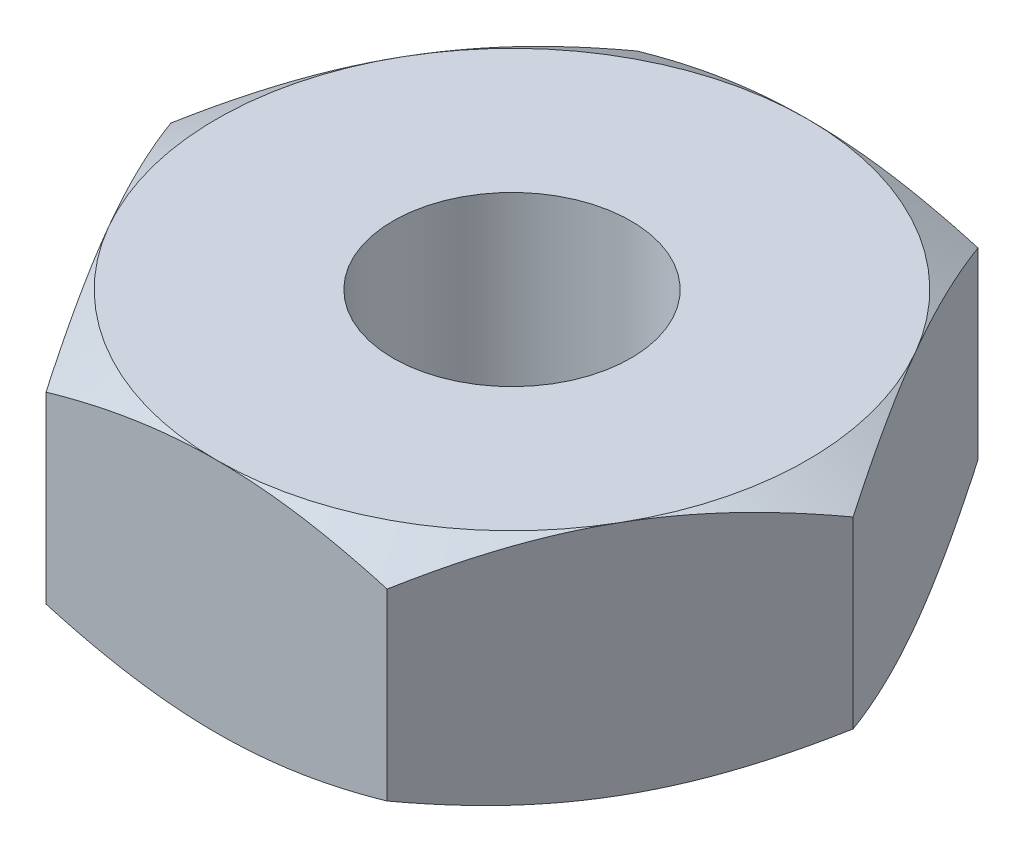
ISO-10303-21;
HEADER;
FILE_DESCRIPTION(('STEP AP214'),'2;1');
FILE_NAME('part.step','',(''),(''),'','','');
FILE_SCHEMA(('AUTOMOTIVE_DESIGN { 1 0 10303 214 1 1 1 1 }'));
ENDSEC;
DATA;
#1=APPLICATION_CONTEXT('core data for automotive mechanical design processes');
#2=APPLICATION_PROTOCOL_DEFINITION('international standard','automotive_design',2000,#1);
#3=PRODUCT_CONTEXT('',#1,'mechanical');
#4=PRODUCT('Part','Part','',(#3));
#5=PRODUCT_RELATED_PRODUCT_CATEGORY('part','',(#4));
#6=PRODUCT_DEFINITION_FORMATION('','',#4);
#7=PRODUCT_DEFINITION_CONTEXT('part definition',#1,'design');
#8=PRODUCT_DEFINITION('design','',#6,#7);
#9=PRODUCT_DEFINITION_SHAPE('','',#8);
#10=(LENGTH_UNIT() NAMED_UNIT(*) SI_UNIT(.MILLI.,.METRE.));
#11=(NAMED_UNIT(*) PLANE_ANGLE_UNIT() SI_UNIT($,.RADIAN.));
#12=(NAMED_UNIT(*) SI_UNIT($,.STERADIAN.) SOLID_ANGLE_UNIT());
#13=UNCERTAINTY_MEASURE_WITH_UNIT(LENGTH_MEASURE(1.E-05),#10,'distance_accuracy_value','');
#14=(GEOMETRIC_REPRESENTATION_CONTEXT(3) GLOBAL_UNCERTAINTY_ASSIGNED_CONTEXT((#13)) GLOBAL_UNIT_ASSIGNED_CONTEXT((#10,
#11,#12)) REPRESENTATION_CONTEXT('',''));
#15=CARTESIAN_POINT('',(0.,0.,0.));
#16=DIRECTION('',(0.,0.,1.));
#17=DIRECTION('',(1.,0.,0.));
#18=AXIS2_PLACEMENT_3D('',#15,#16,#17);
#19=CARTESIAN_POINT('',(0.,-0.223290993692603,0.));
#20=DIRECTION('',(0.,-1.,0.));
#21=DIRECTION('',(0.,0.,-1.));
#22=AXIS2_PLACEMENT_3D('',#19,#20,#21);
#23=CONICAL_SURFACE('',#22,2.88675134594813,1.0471975511966);
#24=CARTESIAN_POINT('',(-3.82804499372432,-1.1963167632754,2.5));
#25=CARTESIAN_POINT('',(-3.71828085649172,-1.14327266922931,2.5));
#26=CARTESIAN_POINT('',(-3.60825720059553,-1.09075587737962,2.5));
#27=CARTESIAN_POINT('',(-3.38755052986221,-0.987078216748227,2.5));
#28=CARTESIAN_POINT('',(-3.27686740487454,-0.935917582729519,2.5));
#29=CARTESIAN_POINT('',(-3.05410357303958,-0.834984039411597,2.5));
#30=CARTESIAN_POINT('',(-2.94201849305851,-0.785220746914398,2.5));
#31=CARTESIAN_POINT('',(-2.71692709217039,-0.687831615887685,2.5));
#32=CARTESIAN_POINT('',(-2.6039208196471,-0.640205665942511,2.5));
#33=CARTESIAN_POINT('',(-2.3754044171561,-0.547094156496475,2.5));
#34=CARTESIAN_POINT('',(-2.25988058014231,-0.501642052634902,2.5));
#35=CARTESIAN_POINT('',(-2.02747029246855,-0.414297644349636,2.5));
#36=CARTESIAN_POINT('',(-1.91058369184875,-0.372405735979064,2.5));
#37=CARTESIAN_POINT('',(-1.67550198908606,-0.2933073427693,2.5));
#38=CARTESIAN_POINT('',(-1.5573102732053,-0.256090896739897,2.5));
#39=CARTESIAN_POINT('',(-1.31924659147406,-0.187552097840316,2.5));
#40=CARTESIAN_POINT('',(-1.19937516991093,-0.156227881047969,2.5));
#41=CARTESIAN_POINT('',(-0.957870204363746,-0.100994246846276,2.5));
#42=CARTESIAN_POINT('',(-0.836236200197806,-0.0770868037228372,2.5));
#43=CARTESIAN_POINT('',(-0.591501703670343,-0.0382963974514643,2.5));
#44=CARTESIAN_POINT('',(-0.468401210012355,-0.0234134422823114,2.5));
#45=CARTESIAN_POINT('',(-0.222157493517461,-0.00398863321839736,2.5));
#46=CARTESIAN_POINT('',(-0.099019569433754,0.000618687975651005,2.5));
#47=CARTESIAN_POINT('',(0.147170053504671,-0.000752541484247362,2.5));
#48=CARTESIAN_POINT('',(0.270221766445131,-0.00672834425959445,2.5));
#49=CARTESIAN_POINT('',(0.480350397015951,-0.0255492091334948,2.5));
#50=CARTESIAN_POINT('',(0.56765913648864,-0.0359433100274445,2.5));
#51=CARTESIAN_POINT('',(0.741602181646861,-0.0613833814666835,2.5));
#52=CARTESIAN_POINT('',(0.828236378756336,-0.0764300856615301,2.5));
#53=CARTESIAN_POINT('',(1.08705653408106,-0.127759419343896,2.5));
#54=CARTESIAN_POINT('',(1.25802931580452,-0.170218054015723,2.5));
#55=CARTESIAN_POINT('',(1.51386408134078,-0.243447724573255,2.5));
#56=CARTESIAN_POINT('',(1.60005960225962,-0.269821213632275,2.5));
#57=CARTESIAN_POINT('',(1.77155099438378,-0.325177862642354,2.5));
#58=CARTESIAN_POINT('',(1.85684744139724,-0.354159222616823,2.5));
#59=CARTESIAN_POINT('',(2.02618400322713,-0.414128561987682,2.5));
#60=CARTESIAN_POINT('',(2.11022848716774,-0.44510432859594,2.5));
#61=CARTESIAN_POINT('',(2.27766538220572,-0.508873971119192,2.5));
#62=CARTESIAN_POINT('',(2.36105751399617,-0.541668581852109,2.5));
#63=CARTESIAN_POINT('',(2.44414811866678,-0.575193129088623,2.5));
#64=B_SPLINE_CURVE_WITH_KNOTS('',3,(#24,#25,#26,#27,#28,#29,#30,#31,#32,#33,#34,#35,#36,#37,#38,
#39,#40,#41,#42,#43,#44,#45,#46,#47,#48,#49,#50,#51,#52,#53,#54,#55,#56,#57,#58,#59,#60,#61,#62,
#63),.UNSPECIFIED.,.F.,.F.,(4,2,2,2,2,2,2,2,2,2,2,2,2,2,2,2,2,2,2,4),(0.,0.365732370332669,
0.731527644124543,1.09941621653744,1.46728558928017,1.83967125623427,2.21209829506681,
2.58371790436,2.95521975869669,3.32682041917403,3.69842140819258,4.06764803658773,
4.43677881037429,4.70042588015951,4.96411454456775,5.49188432099894,5.76228301186056,
6.03249648197686,6.30118900914357,6.56999089095293),.UNSPECIFIED.);
#65=CARTESIAN_POINT('',(0.,0.,2.5));
#66=VERTEX_POINT('',#65);
#67=CARTESIAN_POINT('',(1.44337567297406,-0.223290993692603,2.5));
#68=VERTEX_POINT('',#67);
#69=EDGE_CURVE('E204',#66,#68,#64,.T.);
#70=ORIENTED_EDGE('',*,*,#69,.T.);
#71=CARTESIAN_POINT('',(1.44326020292022,-0.223357664359109,2.5002));
#72=CARTESIAN_POINT('',(1.50668977106845,-0.186721620107626,2.39033676526513));
#73=CARTESIAN_POINT('',(1.57066685804385,-0.153402218965056,2.27952520010347));
#74=CARTESIAN_POINT('',(1.69972891130041,-0.0952422855578568,2.05598316653395));
#75=CARTESIAN_POINT('',(1.76481617119469,-0.070422329147737,1.94324872547161));
#76=CARTESIAN_POINT('',(1.8941840386774,-0.03178565144105,1.71917700612473));
#77=CARTESIAN_POINT('',(1.95844473900196,-0.0177117961856366,1.60787420823262));
#78=CARTESIAN_POINT('',(2.08726857876804,-0.00090915235274744,1.38474477253166));
#79=CARTESIAN_POINT('',(2.15183124982666,0.00183354879637635,1.27291894598577));
#80=CARTESIAN_POINT('',(2.27247489412633,-0.00386576000805019,1.06395802444848));
#81=CARTESIAN_POINT('',(2.32857390783979,-0.0109083943818581,0.966791682442267));
#82=CARTESIAN_POINT('',(2.44040644260541,-0.0332314191249387,0.773092050288996));
#83=CARTESIAN_POINT('',(2.49613957671839,-0.0485194384402633,0.676559430340266));
#84=CARTESIAN_POINT('',(2.60820277442168,-0.0867390938444164,0.482460278259523));
#85=CARTESIAN_POINT('',(2.66451865130902,-0.109832776125513,0.384918318217859));
#86=CARTESIAN_POINT('',(2.77631036402773,-0.162246656577909,0.191289391923915));
#87=CARTESIAN_POINT('',(2.83178763258717,-0.191554535624544,0.0951999441138239));
#88=CARTESIAN_POINT('',(2.88686681600196,-0.223357664359104,-0.000200000000000038));
#89=B_SPLINE_CURVE_WITH_KNOTS('',3,(#71,#72,#73,#74,#75,#76,#77,#78,#79,#80,#81,#82,#83,#84,#85,
#86,#87,#88),.UNSPECIFIED.,.F.,.F.,(4,2,2,2,2,2,2,2,4),(0.,0.396285827362227,0.793524330152052,
1.18093086852114,1.56786160134475,1.90479741793733,2.24204551660463,2.58677531536756,
2.93082800105256),.UNSPECIFIED.);
#90=CARTESIAN_POINT('',(2.1650635094611,0.,1.24999999999999));
#91=VERTEX_POINT('',#90);
#92=EDGE_CURVE('E348',#68,#91,#89,.T.);
#93=ORIENTED_EDGE('',*,*,#92,.T.);
#94=CARTESIAN_POINT('',(0.,0.,0.));
#95=DIRECTION('',(0.,1.,0.));
#96=DIRECTION('',(0.,0.,1.));
#97=AXIS2_PLACEMENT_3D('',#94,#95,#96);
#98=CIRCLE('',#97,2.5);
#99=EDGE_CURVE('E44',#66,#91,#98,.T.);
#100=ORIENTED_EDGE('',*,*,#99,.F.);
#101=EDGE_LOOP('',(#70,#93,#100));
#102=FACE_BOUND('',#101,.T.);
#103=ADVANCED_FACE('F36',(#102),#23,.T.);
#104=CARTESIAN_POINT('',(2.1650635094611,0.,-1.24999999999999));
#105=VERTEX_POINT('',#104);
#106=EDGE_CURVE('E153',#91,#105,#98,.T.);
#107=ORIENTED_EDGE('',*,*,#106,.F.);
#108=CARTESIAN_POINT('',(2.88675134594812,-0.223290993692603,0.));
#109=VERTEX_POINT('',#108);
#110=EDGE_CURVE('E211',#91,#109,#89,.T.);
#111=ORIENTED_EDGE('',*,*,#110,.T.);
#112=CARTESIAN_POINT('',(2.88686681600196,-0.223357664359104,0.000200000000000186));
#113=CARTESIAN_POINT('',(2.82343724785374,-0.186721620107621,-0.109663234734871));
#114=CARTESIAN_POINT('',(2.75946016087833,-0.153402218965052,-0.220474799896525));
#115=CARTESIAN_POINT('',(2.63039810762177,-0.0952422855578537,-0.44401683346605));
#116=CARTESIAN_POINT('',(2.56531084772749,-0.0704223291477345,-0.556751274528388));
#117=CARTESIAN_POINT('',(2.43594298024479,-0.0317856514410486,-0.780822993875269));
#118=CARTESIAN_POINT('',(2.37168227992022,-0.0177117961856357,-0.892125791767377));
#119=CARTESIAN_POINT('',(2.24285844015414,-0.000909152352747396,-1.11525522746833));
#120=CARTESIAN_POINT('',(2.17829576909552,0.00183354879637596,-1.22708105401423));
#121=CARTESIAN_POINT('',(2.05765212479585,-0.00386576000805159,-1.43604197555152));
#122=CARTESIAN_POINT('',(2.0015531110824,-0.0109083943818601,-1.53320831755773));
#123=CARTESIAN_POINT('',(1.88972057631678,-0.0332314191249415,-1.726907949711));
#124=CARTESIAN_POINT('',(1.8339874422038,-0.0485194384402663,-1.82344056965973));
#125=CARTESIAN_POINT('',(1.7219242445005,-0.0867390938444202,-2.01753972174048));
#126=CARTESIAN_POINT('',(1.66560836761316,-0.109832776125517,-2.11508168178214));
#127=CARTESIAN_POINT('',(1.55381665489446,-0.162246656577914,-2.30871060807609));
#128=CARTESIAN_POINT('',(1.49833938633502,-0.19155453562455,-2.40480005588618));
#129=CARTESIAN_POINT('',(1.44326020292023,-0.22335766435911,-2.5002));
#130=B_SPLINE_CURVE_WITH_KNOTS('',3,(#112,#113,#114,#115,#116,#117,#118,#119,#120,#121,#122,
#123,#124,#125,#126,#127,#128,#129),.UNSPECIFIED.,.F.,.F.,(4,2,2,2,2,2,2,2,4),(0.,
0.396285827362226,0.793524330152049,1.18093086852114,1.56786160134475,1.90479741793733,
2.24204551660462,2.58677531536756,2.93082800105256),.UNSPECIFIED.);
#131=EDGE_CURVE('E222',#109,#105,#130,.T.);
#132=ORIENTED_EDGE('',*,*,#131,.T.);
#133=EDGE_LOOP('',(#107,#111,#132));
#134=FACE_BOUND('',#133,.T.);
#135=ADVANCED_FACE('F334',(#134),#23,.T.);
#136=CARTESIAN_POINT('',(0.,0.,-2.5));
#137=VERTEX_POINT('',#136);
#138=EDGE_CURVE('E152',#105,#137,#98,.T.);
#139=ORIENTED_EDGE('',*,*,#138,.F.);
#140=CARTESIAN_POINT('',(1.44337567297407,-0.223290993692603,-2.5));
#141=VERTEX_POINT('',#140);
#142=EDGE_CURVE('E217',#105,#141,#130,.T.);
#143=ORIENTED_EDGE('',*,*,#142,.T.);
#144=CARTESIAN_POINT('',(-3.82804499372432,-1.1963167632754,-2.5));
#145=CARTESIAN_POINT('',(-3.71828085649172,-1.14327266922931,-2.5));
#146=CARTESIAN_POINT('',(-3.60825720059553,-1.09075587737962,-2.5));
#147=CARTESIAN_POINT('',(-3.38755052986221,-0.987078216748226,-2.5));
#148=CARTESIAN_POINT('',(-3.27686740487454,-0.935917582729518,-2.5));
#149=CARTESIAN_POINT('',(-3.05410357303958,-0.834984039411597,-2.5));
#150=CARTESIAN_POINT('',(-2.94201849305851,-0.785220746914397,-2.5));
#151=CARTESIAN_POINT('',(-2.71692709217039,-0.687831615887684,-2.5));
#152=CARTESIAN_POINT('',(-2.6039208196471,-0.640205665942511,-2.5));
#153=CARTESIAN_POINT('',(-2.3754044171561,-0.547094156496475,-2.5));
#154=CARTESIAN_POINT('',(-2.25988058014231,-0.501642052634902,-2.5));
#155=CARTESIAN_POINT('',(-2.02747029246855,-0.414297644349636,-2.5));
#156=CARTESIAN_POINT('',(-1.91058369184875,-0.372405735979064,-2.5));
#157=CARTESIAN_POINT('',(-1.67550198908606,-0.2933073427693,-2.5));
#158=CARTESIAN_POINT('',(-1.5573102732053,-0.256090896739897,-2.5));
#159=CARTESIAN_POINT('',(-1.31924659147406,-0.187552097840316,-2.5));
#160=CARTESIAN_POINT('',(-1.19937516991093,-0.156227881047969,-2.5));
#161=CARTESIAN_POINT('',(-0.957870204363745,-0.100994246846275,-2.5));
#162=CARTESIAN_POINT('',(-0.836236200197806,-0.0770868037228369,-2.5));
#163=CARTESIAN_POINT('',(-0.591501703670342,-0.0382963974514641,-2.5));
#164=CARTESIAN_POINT('',(-0.468401210012355,-0.0234134422823114,-2.5));
#165=CARTESIAN_POINT('',(-0.22215749351746,-0.00398863321839739,-2.5));
#166=CARTESIAN_POINT('',(-0.0990195694337533,0.000618687975651037,-2.5));
#167=CARTESIAN_POINT('',(0.147170053504672,-0.00075254148424739,-2.5));
#168=CARTESIAN_POINT('',(0.270221766445132,-0.00672834425959454,-2.5));
#169=CARTESIAN_POINT('',(0.480350397015952,-0.0255492091334948,-2.5));
#170=CARTESIAN_POINT('',(0.567659136488641,-0.0359433100274444,-2.5));
#171=CARTESIAN_POINT('',(0.741602181646862,-0.0613833814666835,-2.5));
#172=CARTESIAN_POINT('',(0.828236378756337,-0.0764300856615303,-2.5));
#173=CARTESIAN_POINT('',(1.08705653408106,-0.127759419343896,-2.5));
#174=CARTESIAN_POINT('',(1.25802931580452,-0.170218054015723,-2.5));
#175=CARTESIAN_POINT('',(1.51386408134078,-0.243447724573254,-2.5));
#176=CARTESIAN_POINT('',(1.60005960225962,-0.269821213632275,-2.5));
#177=CARTESIAN_POINT('',(1.77155099438378,-0.325177862642354,-2.5));
#178=CARTESIAN_POINT('',(1.85684744139724,-0.354159222616823,-2.5));
#179=CARTESIAN_POINT('',(2.02618400322714,-0.414128561987682,-2.5));
#180=CARTESIAN_POINT('',(2.11022848716774,-0.445104328595941,-2.5));
#181=CARTESIAN_POINT('',(2.27766538220572,-0.508873971119192,-2.5));
#182=CARTESIAN_POINT('',(2.36105751399617,-0.541668581852109,-2.5));
#183=CARTESIAN_POINT('',(2.44414811866678,-0.575193129088624,-2.5));
#184=B_SPLINE_CURVE_WITH_KNOTS('',3,(#144,#145,#146,#147,#148,#149,#150,#151,#152,#153,#154,
#155,#156,#157,#158,#159,#160,#161,#162,#163,#164,#165,#166,#167,#168,#169,#170,#171,#172,#173,
#174,#175,#176,#177,#178,#179,#180,#181,#182,#183),.UNSPECIFIED.,.F.,.F.,(4,2,2,2,2,2,2,2,2,2,2,
2,2,2,2,2,2,2,2,4),(0.,0.36573237033267,0.731527644124544,1.09941621653744,1.46728558928017,
1.83967125623427,2.21209829506681,2.58371790436,2.95521975869669,3.32682041917403,
3.69842140819258,4.06764803658773,4.43677881037429,4.70042588015951,4.96411454456775,
5.49188432099894,5.76228301186056,6.03249648197686,6.30118900914356,6.56999089095293),.UNSPECIFIED.);
#185=EDGE_CURVE('E163',#141,#137,#184,.F.);
#186=ORIENTED_EDGE('',*,*,#185,.T.);
#187=EDGE_LOOP('',(#139,#143,#186));
#188=FACE_BOUND('',#187,.T.);
#189=ADVANCED_FACE('F338',(#188),#23,.T.);
#190=CARTESIAN_POINT('',(-2.88686681600196,-0.223357664359103,-0.000200000000000521));
#191=CARTESIAN_POINT('',(-2.82343724785374,-0.186721620107621,0.109663234734871));
#192=CARTESIAN_POINT('',(-2.75946016087833,-0.153402218965051,0.220474799896525));
#193=CARTESIAN_POINT('',(-2.63039810762177,-0.0952422855578529,0.444016833466049));
#194=CARTESIAN_POINT('',(-2.56531084772749,-0.0704223291477335,0.556751274528387));
#195=CARTESIAN_POINT('',(-2.43594298024479,-0.0317856514410474,0.780822993875267));
#196=CARTESIAN_POINT('',(-2.37168227992022,-0.0177117961856345,0.892125791767375));
#197=CARTESIAN_POINT('',(-2.24285844015414,-0.000909152352746326,1.11525522746833));
#198=CARTESIAN_POINT('',(-2.17829576909552,0.00183354879637692,1.22708105401422));
#199=CARTESIAN_POINT('',(-2.05765212479585,-0.00386576000805051,1.43604197555152));
#200=CARTESIAN_POINT('',(-2.0015531110824,-0.0109083943818589,1.53320831755773));
#201=CARTESIAN_POINT('',(-1.88972057631677,-0.0332314191249402,1.726907949711));
#202=CARTESIAN_POINT('',(-1.83398744220379,-0.0485194384402652,1.82344056965973));
#203=CARTESIAN_POINT('',(-1.7219242445005,-0.0867390938444191,2.01753972174048));
#204=CARTESIAN_POINT('',(-1.66560836761316,-0.109832776125516,2.11508168178214));
#205=CARTESIAN_POINT('',(-1.55381665489445,-0.162246656577913,2.30871060807609));
#206=CARTESIAN_POINT('',(-1.49833938633502,-0.191554535624549,2.40480005588618));
#207=CARTESIAN_POINT('',(-1.44326020292022,-0.223357664359109,2.5002));
#208=B_SPLINE_CURVE_WITH_KNOTS('',3,(#190,#191,#192,#193,#194,#195,#196,#197,#198,#199,#200,
#201,#202,#203,#204,#205,#206,#207),.UNSPECIFIED.,.F.,.F.,(4,2,2,2,2,2,2,2,4),(0.,
0.396285827362226,0.793524330152049,1.18093086852114,1.56786160134475,1.90479741793733,
2.24204551660462,2.58677531536756,2.93082800105256),.UNSPECIFIED.);
#209=CARTESIAN_POINT('',(-2.1650635094611,0.,1.24999999999999));
#210=VERTEX_POINT('',#209);
#211=CARTESIAN_POINT('',(-1.44337567297406,-0.223290993692603,2.5));
#212=VERTEX_POINT('',#211);
#213=EDGE_CURVE('E196',#210,#212,#208,.T.);
#214=ORIENTED_EDGE('',*,*,#213,.T.);
#215=EDGE_CURVE('E246',#212,#66,#64,.T.);
#216=ORIENTED_EDGE('',*,*,#215,.T.);
#217=EDGE_CURVE('E147',#210,#66,#98,.T.);
#218=ORIENTED_EDGE('',*,*,#217,.F.);
#219=EDGE_LOOP('',(#214,#216,#218));
#220=FACE_BOUND('',#219,.T.);
#221=ADVANCED_FACE('F343',(#220),#23,.T.);
#222=CARTESIAN_POINT('',(-2.1650635094611,0.,-1.24999999999999));
#223=VERTEX_POINT('',#222);
#224=EDGE_CURVE('E136',#137,#223,#98,.T.);
#225=ORIENTED_EDGE('',*,*,#224,.F.);
#226=CARTESIAN_POINT('',(-1.44337567297406,-0.223290993692603,-2.5));
#227=VERTEX_POINT('',#226);
#228=EDGE_CURVE('E138',#137,#227,#184,.F.);
#229=ORIENTED_EDGE('',*,*,#228,.T.);
#230=CARTESIAN_POINT('',(-1.44326020292022,-0.223357664359109,-2.5002));
#231=CARTESIAN_POINT('',(-1.50668977106845,-0.186721620107626,-2.39033676526513));
#232=CARTESIAN_POINT('',(-1.57066685804385,-0.153402218965056,-2.27952520010347));
#233=CARTESIAN_POINT('',(-1.69972891130041,-0.0952422855578568,-2.05598316653395));
#234=CARTESIAN_POINT('',(-1.76481617119469,-0.0704223291477371,-1.94324872547161));
#235=CARTESIAN_POINT('',(-1.8941840386774,-0.03178565144105,-1.71917700612473));
#236=CARTESIAN_POINT('',(-1.95844473900196,-0.0177117961856364,-1.60787420823262));
#237=CARTESIAN_POINT('',(-2.08726857876804,-0.000909152352747054,-1.38474477253166));
#238=CARTESIAN_POINT('',(-2.15183124982666,0.00183354879637666,-1.27291894598577));
#239=CARTESIAN_POINT('',(-2.27247489412633,-0.00386576000804989,-1.06395802444848));
#240=CARTESIAN_POINT('',(-2.32857390783979,-0.0109083943818577,-0.966791682442267));
#241=CARTESIAN_POINT('',(-2.44040644260541,-0.0332314191249382,-0.773092050288996));
#242=CARTESIAN_POINT('',(-2.49613957671839,-0.0485194384402627,-0.676559430340266));
#243=CARTESIAN_POINT('',(-2.60820277442168,-0.0867390938444157,-0.482460278259523));
#244=CARTESIAN_POINT('',(-2.66451865130902,-0.109832776125512,-0.384918318217859));
#245=CARTESIAN_POINT('',(-2.77631036402773,-0.162246656577908,-0.191289391923915));
#246=CARTESIAN_POINT('',(-2.83178763258717,-0.191554535624543,-0.0951999441138242));
#247=CARTESIAN_POINT('',(-2.88686681600196,-0.223357664359103,0.000199999999999744));
#248=B_SPLINE_CURVE_WITH_KNOTS('',3,(#230,#231,#232,#233,#234,#235,#236,#237,#238,#239,#240,
#241,#242,#243,#244,#245,#246,#247),.UNSPECIFIED.,.F.,.F.,(4,2,2,2,2,2,2,2,4),(0.,
0.396285827362227,0.793524330152052,1.18093086852114,1.56786160134476,1.90479741793733,
2.24204551660463,2.58677531536756,2.93082800105256),.UNSPECIFIED.);
#249=EDGE_CURVE('E125',#227,#223,#248,.T.);
#250=ORIENTED_EDGE('',*,*,#249,.T.);
#251=EDGE_LOOP('',(#225,#229,#250));
#252=FACE_BOUND('',#251,.T.);
#253=ADVANCED_FACE('F134',(#252),#23,.T.);
#254=CARTESIAN_POINT('',(0.,-2.,0.));
#255=DIRECTION('',(0.,1.,0.));
#256=DIRECTION('',(0.,0.,1.));
#257=AXIS2_PLACEMENT_3D('',#254,#255,#256);
#258=CONICAL_SURFACE('',#257,2.5,1.0471975511966);
#259=CARTESIAN_POINT('',(-2.88686681600196,-1.7766423356409,0.000199999999999479));
#260=CARTESIAN_POINT('',(-2.82343724785374,-1.81327837989238,-0.109663234734871));
#261=CARTESIAN_POINT('',(-2.75946016087833,-1.84659778103495,-0.220474799896526));
#262=CARTESIAN_POINT('',(-2.63039810762177,-1.90475771444215,-0.44401683346605));
#263=CARTESIAN_POINT('',(-2.56531084772749,-1.92957767085227,-0.556751274528388));
#264=CARTESIAN_POINT('',(-2.43594298024479,-1.96821434855895,-0.780822993875268));
#265=CARTESIAN_POINT('',(-2.37168227992022,-1.98228820381437,-0.892125791767376));
#266=CARTESIAN_POINT('',(-2.24285844015414,-1.99909084764725,-1.11525522746833));
#267=CARTESIAN_POINT('',(-2.17829576909552,-2.00183354879638,-1.22708105401423));
#268=CARTESIAN_POINT('',(-2.05765212479585,-1.99613423999195,-1.43604197555152));
#269=CARTESIAN_POINT('',(-2.0015531110824,-1.98909160561814,-1.53320831755773));
#270=CARTESIAN_POINT('',(-1.88972057631677,-1.96676858087506,-1.726907949711));
#271=CARTESIAN_POINT('',(-1.83398744220379,-1.95148056155973,-1.82344056965973));
#272=CARTESIAN_POINT('',(-1.7219242445005,-1.91326090615558,-2.01753972174048));
#273=CARTESIAN_POINT('',(-1.66560836761316,-1.89016722387448,-2.11508168178214));
#274=CARTESIAN_POINT('',(-1.55381665489445,-1.83775334342209,-2.30871060807609));
#275=CARTESIAN_POINT('',(-1.49833938633502,-1.80844546437545,-2.40480005588618));
#276=CARTESIAN_POINT('',(-1.44326020292022,-1.77664233564089,-2.5002));
#277=B_SPLINE_CURVE_WITH_KNOTS('',3,(#259,#260,#261,#262,#263,#264,#265,#266,#267,#268,#269,
#270,#271,#272,#273,#274,#275,#276),.UNSPECIFIED.,.F.,.F.,(4,2,2,2,2,2,2,2,4),(0.,
0.396285827362226,0.793524330152049,1.18093086852114,1.56786160134475,1.90479741793733,
2.24204551660462,2.58677531536756,2.93082800105256),.UNSPECIFIED.);
#278=CARTESIAN_POINT('',(-2.1650635094611,-2.,-1.24999999999999));
#279=VERTEX_POINT('',#278);
#280=CARTESIAN_POINT('',(-1.44337567297406,-1.7767090063074,-2.5));
#281=VERTEX_POINT('',#280);
#282=EDGE_CURVE('E280',#279,#281,#277,.T.);
#283=ORIENTED_EDGE('',*,*,#282,.T.);
#284=CARTESIAN_POINT('',(-3.82804499372432,-0.8036832367246,-2.5));
#285=CARTESIAN_POINT('',(-3.71828085649172,-0.856727330770688,-2.5));
#286=CARTESIAN_POINT('',(-3.60825720059553,-0.909244122620376,-2.5));
#287=CARTESIAN_POINT('',(-3.38755052986221,-1.01292178325177,-2.5));
#288=CARTESIAN_POINT('',(-3.27686740487454,-1.06408241727048,-2.5));
#289=CARTESIAN_POINT('',(-3.05410357303958,-1.1650159605884,-2.5));
#290=CARTESIAN_POINT('',(-2.94201849305851,-1.2147792530856,-2.5));
#291=CARTESIAN_POINT('',(-2.71692709217039,-1.31216838411231,-2.5));
#292=CARTESIAN_POINT('',(-2.6039208196471,-1.35979433405749,-2.5));
#293=CARTESIAN_POINT('',(-2.3754044171561,-1.45290584350352,-2.5));
#294=CARTESIAN_POINT('',(-2.25988058014231,-1.4983579473651,-2.5));
#295=CARTESIAN_POINT('',(-2.02747029246855,-1.58570235565036,-2.5));
#296=CARTESIAN_POINT('',(-1.91058369184875,-1.62759426402094,-2.5));
#297=CARTESIAN_POINT('',(-1.67550198908606,-1.7066926572307,-2.5));
#298=CARTESIAN_POINT('',(-1.5573102732053,-1.7439091032601,-2.5));
#299=CARTESIAN_POINT('',(-1.31924659147406,-1.81244790215968,-2.5));
#300=CARTESIAN_POINT('',(-1.19937516991093,-1.84377211895203,-2.5));
#301=CARTESIAN_POINT('',(-0.957870204363746,-1.89900575315372,-2.5));
#302=CARTESIAN_POINT('',(-0.836236200197806,-1.92291319627716,-2.5));
#303=CARTESIAN_POINT('',(-0.591501703670342,-1.96170360254854,-2.5));
#304=CARTESIAN_POINT('',(-0.468401210012355,-1.97658655771769,-2.5));
#305=CARTESIAN_POINT('',(-0.222157493517461,-1.9960113667816,-2.5));
#306=CARTESIAN_POINT('',(-0.0990195694337535,-2.00061868797565,-2.5));
#307=CARTESIAN_POINT('',(0.147170053504671,-1.99924745851575,-2.5));
#308=CARTESIAN_POINT('',(0.270221766445132,-1.99327165574041,-2.5));
#309=CARTESIAN_POINT('',(0.480350397015951,-1.9744507908665,-2.5));
#310=CARTESIAN_POINT('',(0.567659136488641,-1.96405668997256,-2.5));
#311=CARTESIAN_POINT('',(0.741602181646861,-1.93861661853332,-2.5));
#312=CARTESIAN_POINT('',(0.828236378756336,-1.92356991433847,-2.5));
#313=CARTESIAN_POINT('',(1.08705653408106,-1.8722405806561,-2.5));
#314=CARTESIAN_POINT('',(1.25802931580452,-1.82978194598428,-2.5));
#315=CARTESIAN_POINT('',(1.51386408134078,-1.75655227542675,-2.5));
#316=CARTESIAN_POINT('',(1.60005960225962,-1.73017878636772,-2.5));
#317=CARTESIAN_POINT('',(1.77155099438378,-1.67482213735765,-2.5));
#318=CARTESIAN_POINT('',(1.85684744139724,-1.64584077738318,-2.5));
#319=CARTESIAN_POINT('',(2.02618400322714,-1.58587143801232,-2.5));
#320=CARTESIAN_POINT('',(2.11022848716774,-1.55489567140406,-2.5));
#321=CARTESIAN_POINT('',(2.27766538220572,-1.49112602888081,-2.5));
#322=CARTESIAN_POINT('',(2.36105751399617,-1.45833141814789,-2.5));
#323=CARTESIAN_POINT('',(2.44414811866678,-1.42480687091138,-2.5));
#324=B_SPLINE_CURVE_WITH_KNOTS('',3,(#284,#285,#286,#287,#288,#289,#290,#291,#292,#293,#294,
#295,#296,#297,#298,#299,#300,#301,#302,#303,#304,#305,#306,#307,#308,#309,#310,#311,#312,#313,
#314,#315,#316,#317,#318,#319,#320,#321,#322,#323),.UNSPECIFIED.,.F.,.F.,(4,2,2,2,2,2,2,2,2,2,2,
2,2,2,2,2,2,2,2,4),(0.,0.36573237033267,0.731527644124543,1.09941621653744,1.46728558928017,
1.83967125623427,2.21209829506681,2.58371790436,2.95521975869669,3.32682041917403,
3.69842140819258,4.06764803658773,4.43677881037429,4.70042588015951,4.96411454456775,
5.49188432099894,5.76228301186056,6.03249648197686,6.30118900914357,6.56999089095293),.UNSPECIFIED.);
#325=CARTESIAN_POINT('',(0.,-2.,-2.5));
#326=VERTEX_POINT('',#325);
#327=EDGE_CURVE('E170',#281,#326,#324,.T.);
#328=ORIENTED_EDGE('',*,*,#327,.T.);
#329=CARTESIAN_POINT('',(0.,-2.,0.));
#330=DIRECTION('',(0.,1.,0.));
#331=DIRECTION('',(0.,0.,1.));
#332=AXIS2_PLACEMENT_3D('',#329,#330,#331);
#333=CIRCLE('',#332,2.5);
#334=EDGE_CURVE('E308',#326,#279,#333,.T.);
#335=ORIENTED_EDGE('',*,*,#334,.T.);
#336=EDGE_LOOP('',(#283,#328,#335));
#337=FACE_BOUND('',#336,.T.);
#338=ADVANCED_FACE('F307',(#337),#258,.T.);
#339=CARTESIAN_POINT('',(2.1650635094611,-2.,-1.24999999999999));
#340=VERTEX_POINT('',#339);
#341=EDGE_CURVE('E320',#340,#326,#333,.T.);
#342=ORIENTED_EDGE('',*,*,#341,.T.);
#343=CARTESIAN_POINT('',(1.44337567297407,-1.7767090063074,-2.5));
#344=VERTEX_POINT('',#343);
#345=EDGE_CURVE('E171',#326,#344,#324,.T.);
#346=ORIENTED_EDGE('',*,*,#345,.T.);
#347=CARTESIAN_POINT('',(1.44326020292023,-1.77664233564089,-2.5002));
#348=CARTESIAN_POINT('',(1.50668977106845,-1.81327837989237,-2.39033676526513));
#349=CARTESIAN_POINT('',(1.57066685804385,-1.84659778103494,-2.27952520010347));
#350=CARTESIAN_POINT('',(1.69972891130041,-1.90475771444214,-2.05598316653395));
#351=CARTESIAN_POINT('',(1.7648161711947,-1.92957767085226,-1.94324872547161));
#352=CARTESIAN_POINT('',(1.8941840386774,-1.96821434855895,-1.71917700612473));
#353=CARTESIAN_POINT('',(1.95844473900197,-1.98228820381436,-1.60787420823262));
#354=CARTESIAN_POINT('',(2.08726857876804,-1.99909084764725,-1.38474477253166));
#355=CARTESIAN_POINT('',(2.15183124982667,-2.00183354879638,-1.27291894598577));
#356=CARTESIAN_POINT('',(2.27247489412633,-1.99613423999195,-1.06395802444848));
#357=CARTESIAN_POINT('',(2.32857390783979,-1.98909160561814,-0.966791682442267));
#358=CARTESIAN_POINT('',(2.44040644260541,-1.96676858087506,-0.773092050288996));
#359=CARTESIAN_POINT('',(2.49613957671839,-1.95148056155974,-0.676559430340266));
#360=CARTESIAN_POINT('',(2.60820277442168,-1.91326090615558,-0.482460278259523));
#361=CARTESIAN_POINT('',(2.66451865130902,-1.89016722387449,-0.384918318217859));
#362=CARTESIAN_POINT('',(2.77631036402773,-1.83775334342209,-0.191289391923915));
#363=CARTESIAN_POINT('',(2.83178763258717,-1.80844546437546,-0.0951999441138241));
#364=CARTESIAN_POINT('',(2.88686681600196,-1.7766423356409,0.000199999999999715));
#365=B_SPLINE_CURVE_WITH_KNOTS('',3,(#347,#348,#349,#350,#351,#352,#353,#354,#355,#356,#357,
#358,#359,#360,#361,#362,#363,#364),.UNSPECIFIED.,.F.,.F.,(4,2,2,2,2,2,2,2,4),(0.,
0.396285827362227,0.793524330152052,1.18093086852114,1.56786160134476,1.90479741793733,
2.24204551660463,2.58677531536756,2.93082800105256),.UNSPECIFIED.);
#366=EDGE_CURVE('E223',#344,#340,#365,.T.);
#367=ORIENTED_EDGE('',*,*,#366,.T.);
#368=EDGE_LOOP('',(#342,#346,#367));
#369=FACE_BOUND('',#368,.T.);
#370=ADVANCED_FACE('F331',(#369),#258,.T.);
#371=CARTESIAN_POINT('',(2.1650635094611,-2.,1.24999999999999));
#372=VERTEX_POINT('',#371);
#373=EDGE_CURVE('E158',#372,#340,#333,.T.);
#374=ORIENTED_EDGE('',*,*,#373,.T.);
#375=CARTESIAN_POINT('',(2.88675134594812,-1.7767090063074,0.));
#376=VERTEX_POINT('',#375);
#377=EDGE_CURVE('E224',#340,#376,#365,.T.);
#378=ORIENTED_EDGE('',*,*,#377,.T.);
#379=CARTESIAN_POINT('',(2.88686681600196,-1.7766423356409,-0.000199999999999947));
#380=CARTESIAN_POINT('',(2.82343724785374,-1.81327837989238,0.109663234734871));
#381=CARTESIAN_POINT('',(2.75946016087833,-1.84659778103495,0.220474799896526));
#382=CARTESIAN_POINT('',(2.63039810762177,-1.90475771444215,0.444016833466049));
#383=CARTESIAN_POINT('',(2.56531084772749,-1.92957767085227,0.556751274528388));
#384=CARTESIAN_POINT('',(2.43594298024479,-1.96821434855895,0.780822993875268));
#385=CARTESIAN_POINT('',(2.37168227992022,-1.98228820381437,0.892125791767376));
#386=CARTESIAN_POINT('',(2.24285844015414,-1.99909084764725,1.11525522746833));
#387=CARTESIAN_POINT('',(2.17829576909552,-2.00183354879638,1.22708105401423));
#388=CARTESIAN_POINT('',(2.05765212479585,-1.99613423999195,1.43604197555152));
#389=CARTESIAN_POINT('',(2.0015531110824,-1.98909160561814,1.53320831755773));
#390=CARTESIAN_POINT('',(1.88972057631677,-1.96676858087506,1.726907949711));
#391=CARTESIAN_POINT('',(1.83398744220379,-1.95148056155973,1.82344056965973));
#392=CARTESIAN_POINT('',(1.7219242445005,-1.91326090615558,2.01753972174048));
#393=CARTESIAN_POINT('',(1.66560836761316,-1.89016722387448,2.11508168178214));
#394=CARTESIAN_POINT('',(1.55381665489445,-1.83775334342209,2.30871060807609));
#395=CARTESIAN_POINT('',(1.49833938633502,-1.80844546437545,2.40480005588618));
#396=CARTESIAN_POINT('',(1.44326020292022,-1.77664233564089,2.5002));
#397=B_SPLINE_CURVE_WITH_KNOTS('',3,(#379,#380,#381,#382,#383,#384,#385,#386,#387,#388,#389,
#390,#391,#392,#393,#394,#395,#396),.UNSPECIFIED.,.F.,.F.,(4,2,2,2,2,2,2,2,4),(0.,
0.396285827362226,0.793524330152049,1.18093086852114,1.56786160134475,1.90479741793733,
2.24204551660463,2.58677531536756,2.93082800105256),.UNSPECIFIED.);
#398=EDGE_CURVE('E245',#376,#372,#397,.T.);
#399=ORIENTED_EDGE('',*,*,#398,.T.);
#400=EDGE_LOOP('',(#374,#378,#399));
#401=FACE_BOUND('',#400,.T.);
#402=ADVANCED_FACE('F326',(#401),#258,.T.);
#403=CARTESIAN_POINT('',(0.,-2.,2.5));
#404=VERTEX_POINT('',#403);
#405=EDGE_CURVE('E155',#404,#372,#333,.T.);
#406=ORIENTED_EDGE('',*,*,#405,.T.);
#407=CARTESIAN_POINT('',(1.44337567297406,-1.7767090063074,2.5));
#408=VERTEX_POINT('',#407);
#409=EDGE_CURVE('E240',#372,#408,#397,.T.);
#410=ORIENTED_EDGE('',*,*,#409,.T.);
#411=CARTESIAN_POINT('',(-3.82804499372432,-0.803683236724599,2.5));
#412=CARTESIAN_POINT('',(-3.71828085649172,-0.856727330770688,2.5));
#413=CARTESIAN_POINT('',(-3.60825720059553,-0.909244122620376,2.5));
#414=CARTESIAN_POINT('',(-3.38755052986221,-1.01292178325177,2.5));
#415=CARTESIAN_POINT('',(-3.27686740487454,-1.06408241727048,2.5));
#416=CARTESIAN_POINT('',(-3.05410357303958,-1.1650159605884,2.5));
#417=CARTESIAN_POINT('',(-2.94201849305851,-1.2147792530856,2.5));
#418=CARTESIAN_POINT('',(-2.71692709217039,-1.31216838411232,2.5));
#419=CARTESIAN_POINT('',(-2.6039208196471,-1.35979433405749,2.5));
#420=CARTESIAN_POINT('',(-2.3754044171561,-1.45290584350353,2.5));
#421=CARTESIAN_POINT('',(-2.25988058014231,-1.4983579473651,2.5));
#422=CARTESIAN_POINT('',(-2.02747029246855,-1.58570235565036,2.5));
#423=CARTESIAN_POINT('',(-1.91058369184875,-1.62759426402094,2.5));
#424=CARTESIAN_POINT('',(-1.67550198908606,-1.7066926572307,2.5));
#425=CARTESIAN_POINT('',(-1.5573102732053,-1.7439091032601,2.5));
#426=CARTESIAN_POINT('',(-1.31924659147406,-1.81244790215968,2.5));
#427=CARTESIAN_POINT('',(-1.19937516991093,-1.84377211895203,2.5));
#428=CARTESIAN_POINT('',(-0.957870204363746,-1.89900575315372,2.5));
#429=CARTESIAN_POINT('',(-0.836236200197806,-1.92291319627716,2.5));
#430=CARTESIAN_POINT('',(-0.591501703670343,-1.96170360254854,2.5));
#431=CARTESIAN_POINT('',(-0.468401210012356,-1.97658655771769,2.5));
#432=CARTESIAN_POINT('',(-0.222157493517461,-1.9960113667816,2.5));
#433=CARTESIAN_POINT('',(-0.0990195694337541,-2.00061868797565,2.5));
#434=CARTESIAN_POINT('',(0.147170053504671,-1.99924745851575,2.5));
#435=CARTESIAN_POINT('',(0.270221766445131,-1.99327165574041,2.5));
#436=CARTESIAN_POINT('',(0.480350397015951,-1.97445079086651,2.5));
#437=CARTESIAN_POINT('',(0.56765913648864,-1.96405668997256,2.5));
#438=CARTESIAN_POINT('',(0.741602181646861,-1.93861661853332,2.5));
#439=CARTESIAN_POINT('',(0.828236378756336,-1.92356991433847,2.5));
#440=CARTESIAN_POINT('',(1.08705653408106,-1.8722405806561,2.5));
#441=CARTESIAN_POINT('',(1.25802931580452,-1.82978194598428,2.5));
#442=CARTESIAN_POINT('',(1.51386408134078,-1.75655227542675,2.5));
#443=CARTESIAN_POINT('',(1.60005960225962,-1.73017878636772,2.5));
#444=CARTESIAN_POINT('',(1.77155099438378,-1.67482213735765,2.5));
#445=CARTESIAN_POINT('',(1.85684744139724,-1.64584077738318,2.5));
#446=CARTESIAN_POINT('',(2.02618400322713,-1.58587143801232,2.5));
#447=CARTESIAN_POINT('',(2.11022848716774,-1.55489567140406,2.5));
#448=CARTESIAN_POINT('',(2.27766538220572,-1.49112602888081,2.5));
#449=CARTESIAN_POINT('',(2.36105751399617,-1.45833141814789,2.5));
#450=CARTESIAN_POINT('',(2.44414811866678,-1.42480687091138,2.5));
#451=B_SPLINE_CURVE_WITH_KNOTS('',3,(#411,#412,#413,#414,#415,#416,#417,#418,#419,#420,#421,
#422,#423,#424,#425,#426,#427,#428,#429,#430,#431,#432,#433,#434,#435,#436,#437,#438,#439,#440,
#441,#442,#443,#444,#445,#446,#447,#448,#449,#450),.UNSPECIFIED.,.F.,.F.,(4,2,2,2,2,2,2,2,2,2,2,
2,2,2,2,2,2,2,2,4),(0.,0.365732370332671,0.731527644124544,1.09941621653744,1.46728558928017,
1.83967125623427,2.21209829506681,2.58371790436,2.95521975869669,3.32682041917403,
3.69842140819258,4.06764803658773,4.43677881037429,4.70042588015951,4.96411454456775,
5.49188432099894,5.76228301186056,6.03249648197686,6.30118900914356,6.56999089095293),.UNSPECIFIED.);
#452=EDGE_CURVE('E254',#408,#404,#451,.F.);
#453=ORIENTED_EDGE('',*,*,#452,.T.);
#454=EDGE_LOOP('',(#406,#410,#453));
#455=FACE_BOUND('',#454,.T.);
#456=ADVANCED_FACE('F324',(#455),#258,.T.);
#457=CARTESIAN_POINT('',(-2.1650635094611,-2.,1.24999999999999));
#458=VERTEX_POINT('',#457);
#459=EDGE_CURVE('E159',#458,#404,#333,.T.);
#460=ORIENTED_EDGE('',*,*,#459,.T.);
#461=CARTESIAN_POINT('',(-1.44337567297406,-1.7767090063074,2.5));
#462=VERTEX_POINT('',#461);
#463=EDGE_CURVE('E258',#404,#462,#451,.F.);
#464=ORIENTED_EDGE('',*,*,#463,.T.);
#465=CARTESIAN_POINT('',(-1.44326020292022,-1.77664233564089,2.5002));
#466=CARTESIAN_POINT('',(-1.50668977106845,-1.81327837989237,2.39033676526513));
#467=CARTESIAN_POINT('',(-1.57066685804385,-1.84659778103494,2.27952520010347));
#468=CARTESIAN_POINT('',(-1.69972891130041,-1.90475771444214,2.05598316653395));
#469=CARTESIAN_POINT('',(-1.76481617119469,-1.92957767085226,1.94324872547161));
#470=CARTESIAN_POINT('',(-1.8941840386774,-1.96821434855895,1.71917700612473));
#471=CARTESIAN_POINT('',(-1.95844473900196,-1.98228820381436,1.60787420823262));
#472=CARTESIAN_POINT('',(-2.08726857876804,-1.99909084764725,1.38474477253166));
#473=CARTESIAN_POINT('',(-2.15183124982666,-2.00183354879638,1.27291894598577));
#474=CARTESIAN_POINT('',(-2.27247489412633,-1.99613423999195,1.06395802444848));
#475=CARTESIAN_POINT('',(-2.32857390783979,-1.98909160561814,0.966791682442267));
#476=CARTESIAN_POINT('',(-2.44040644260541,-1.96676858087506,0.773092050288996));
#477=CARTESIAN_POINT('',(-2.49613957671839,-1.95148056155974,0.676559430340267));
#478=CARTESIAN_POINT('',(-2.60820277442168,-1.91326090615558,0.482460278259523));
#479=CARTESIAN_POINT('',(-2.66451865130902,-1.89016722387449,0.384918318217858));
#480=CARTESIAN_POINT('',(-2.77631036402773,-1.83775334342209,0.191289391923914));
#481=CARTESIAN_POINT('',(-2.83178763258717,-1.80844546437546,0.0951999441138231));
#482=CARTESIAN_POINT('',(-2.88686681600196,-1.7766423356409,-0.000200000000000618));
#483=B_SPLINE_CURVE_WITH_KNOTS('',3,(#465,#466,#467,#468,#469,#470,#471,#472,#473,#474,#475,
#476,#477,#478,#479,#480,#481,#482),.UNSPECIFIED.,.F.,.F.,(4,2,2,2,2,2,2,2,4),(0.,
0.396285827362227,0.793524330152051,1.18093086852114,1.56786160134475,1.90479741793733,
2.24204551660463,2.58677531536756,2.93082800105256),.UNSPECIFIED.);
#484=EDGE_CURVE('E266',#462,#458,#483,.T.);
#485=ORIENTED_EDGE('',*,*,#484,.T.);
#486=EDGE_LOOP('',(#460,#464,#485));
#487=FACE_BOUND('',#486,.T.);
#488=ADVANCED_FACE('F321',(#487),#258,.T.);
#489=CARTESIAN_POINT('',(0.,0.,0.));
#490=DIRECTION('',(0.,1.,0.));
#491=DIRECTION('',(0.,0.,1.));
#492=AXIS2_PLACEMENT_3D('',#489,#490,#491);
#493=CYLINDRICAL_SURFACE('',#492,1.0065);
#494=CARTESIAN_POINT('',(0.,-2.,0.));
#495=DIRECTION('',(0.,1.,0.));
#496=DIRECTION('',(0.,0.,1.));
#497=AXIS2_PLACEMENT_3D('',#494,#495,#496);
#498=CIRCLE('',#497,1.0065);
#499=CARTESIAN_POINT('',(0.,-2.,1.0065));
#500=VERTEX_POINT('',#499);
#501=EDGE_CURVE('E160',#500,#500,#498,.T.);
#502=ORIENTED_EDGE('',*,*,#501,.F.);
#503=EDGE_LOOP('',(#502));
#504=FACE_BOUND('',#503,.T.);
#505=CARTESIAN_POINT('',(0.,0.,0.));
#506=DIRECTION('',(0.,1.,0.));
#507=DIRECTION('',(0.,0.,1.));
#508=AXIS2_PLACEMENT_3D('',#505,#506,#507);
#509=CIRCLE('',#508,1.0065);
#510=CARTESIAN_POINT('',(0.,0.,1.0065));
#511=VERTEX_POINT('',#510);
#512=EDGE_CURVE('E12',#511,#511,#509,.T.);
#513=ORIENTED_EDGE('',*,*,#512,.T.);
#514=EDGE_LOOP('',(#513));
#515=FACE_BOUND('',#514,.T.);
#516=ADVANCED_FACE('F38',(#504,#515),#493,.F.);
#517=CARTESIAN_POINT('',(1.0065,0.,0.));
#518=DIRECTION('',(0.,-1.,0.));
#519=DIRECTION('',(0.,0.,-1.));
#520=AXIS2_PLACEMENT_3D('',#517,#518,#519);
#521=PLANE('',#520);
#522=ORIENTED_EDGE('',*,*,#512,.F.);
#523=EDGE_LOOP('',(#522));
#524=FACE_BOUND('',#523,.T.);
#525=ORIENTED_EDGE('',*,*,#99,.T.);
#526=ORIENTED_EDGE('',*,*,#106,.T.);
#527=ORIENTED_EDGE('',*,*,#138,.T.);
#528=ORIENTED_EDGE('',*,*,#224,.T.);
#529=EDGE_CURVE('E141',#223,#210,#98,.T.);
#530=ORIENTED_EDGE('',*,*,#529,.T.);
#531=ORIENTED_EDGE('',*,*,#217,.T.);
#532=EDGE_LOOP('',(#525,#526,#527,#528,#530,#531));
#533=FACE_BOUND('',#532,.T.);
#534=ADVANCED_FACE('F149',(#524,#533),#521,.F.);
#535=CARTESIAN_POINT('',(-2.88675134594813,-0.223290993692603,0.));
#536=VERTEX_POINT('',#535);
#537=EDGE_CURVE('E122',#223,#536,#248,.T.);
#538=ORIENTED_EDGE('',*,*,#537,.T.);
#539=EDGE_CURVE('E143',#536,#210,#208,.T.);
#540=ORIENTED_EDGE('',*,*,#539,.T.);
#541=ORIENTED_EDGE('',*,*,#529,.F.);
#542=EDGE_LOOP('',(#538,#540,#541));
#543=FACE_BOUND('',#542,.T.);
#544=ADVANCED_FACE('F142',(#543),#23,.T.);
#545=EDGE_CURVE('E313',#279,#458,#333,.T.);
#546=ORIENTED_EDGE('',*,*,#545,.T.);
#547=CARTESIAN_POINT('',(-2.88675134594812,-1.7767090063074,0.));
#548=VERTEX_POINT('',#547);
#549=EDGE_CURVE('E139',#458,#548,#483,.T.);
#550=ORIENTED_EDGE('',*,*,#549,.T.);
#551=EDGE_CURVE('E129',#548,#279,#277,.T.);
#552=ORIENTED_EDGE('',*,*,#551,.T.);
#553=EDGE_LOOP('',(#546,#550,#552));
#554=FACE_BOUND('',#553,.T.);
#555=ADVANCED_FACE('F183',(#554),#258,.T.);
#556=CARTESIAN_POINT('',(1.0065,-2.,0.));
#557=DIRECTION('',(0.,1.,0.));
#558=DIRECTION('',(0.,0.,1.));
#559=AXIS2_PLACEMENT_3D('',#556,#557,#558);
#560=PLANE('',#559);
#561=ORIENTED_EDGE('',*,*,#405,.F.);
#562=ORIENTED_EDGE('',*,*,#459,.F.);
#563=ORIENTED_EDGE('',*,*,#545,.F.);
#564=ORIENTED_EDGE('',*,*,#334,.F.);
#565=ORIENTED_EDGE('',*,*,#341,.F.);
#566=ORIENTED_EDGE('',*,*,#373,.F.);
#567=EDGE_LOOP('',(#561,#562,#563,#564,#565,#566));
#568=FACE_BOUND('',#567,.T.);
#569=ORIENTED_EDGE('',*,*,#501,.T.);
#570=EDGE_LOOP('',(#569));
#571=FACE_BOUND('',#570,.T.);
#572=ADVANCED_FACE('F316',(#568,#571),#560,.F.);
#573=CARTESIAN_POINT('',(-1.44337567297406,-2.,-2.5));
#574=DIRECTION('',(0.,0.,1.));
#575=DIRECTION('',(1.,0.,0.));
#576=AXIS2_PLACEMENT_3D('',#573,#574,#575);
#577=PLANE('',#576);
#578=DIRECTION('',(0.,1.,0.));
#579=VECTOR('',#578,1.);
#580=CARTESIAN_POINT('',(1.44337567297407,-2.,-2.5));
#581=LINE('',#580,#579);
#582=EDGE_CURVE('E286',#344,#141,#581,.T.);
#583=ORIENTED_EDGE('',*,*,#582,.F.);
#584=ORIENTED_EDGE('',*,*,#345,.F.);
#585=ORIENTED_EDGE('',*,*,#327,.F.);
#586=DIRECTION('',(0.,1.,0.));
#587=VECTOR('',#586,1.);
#588=CARTESIAN_POINT('',(-1.44337567297406,-2.,-2.5));
#589=LINE('',#588,#587);
#590=EDGE_CURVE('E58',#281,#227,#589,.T.);
#591=ORIENTED_EDGE('',*,*,#590,.T.);
#592=ORIENTED_EDGE('',*,*,#228,.F.);
#593=ORIENTED_EDGE('',*,*,#185,.F.);
#594=EDGE_LOOP('',(#583,#584,#585,#591,#592,#593));
#595=FACE_BOUND('',#594,.T.);
#596=ADVANCED_FACE('F177',(#595),#577,.F.);
#597=CARTESIAN_POINT('',(1.44337567297407,-2.,-2.5));
#598=DIRECTION('',(-0.86602540378444,0.,0.499999999999997));
#599=DIRECTION('',(0.499999999999997,0.,0.86602540378444));
#600=AXIS2_PLACEMENT_3D('',#597,#598,#599);
#601=PLANE('',#600);
#602=DIRECTION('',(0.,1.,0.));
#603=VECTOR('',#602,1.);
#604=CARTESIAN_POINT('',(2.88675134594812,-2.,0.));
#605=LINE('',#604,#603);
#606=EDGE_CURVE('E289',#376,#109,#605,.T.);
#607=ORIENTED_EDGE('',*,*,#606,.F.);
#608=ORIENTED_EDGE('',*,*,#377,.F.);
#609=ORIENTED_EDGE('',*,*,#366,.F.);
#610=ORIENTED_EDGE('',*,*,#582,.T.);
#611=ORIENTED_EDGE('',*,*,#142,.F.);
#612=ORIENTED_EDGE('',*,*,#131,.F.);
#613=EDGE_LOOP('',(#607,#608,#609,#610,#611,#612));
#614=FACE_BOUND('',#613,.T.);
#615=ADVANCED_FACE('F228',(#614),#601,.F.);
#616=CARTESIAN_POINT('',(1.44337567297406,-2.,2.5));
#617=DIRECTION('',(-0.86602540378444,0.,-0.499999999999998));
#618=DIRECTION('',(-0.499999999999998,0.,0.86602540378444));
#619=AXIS2_PLACEMENT_3D('',#616,#617,#618);
#620=PLANE('',#619);
#621=DIRECTION('',(0.,1.,0.));
#622=VECTOR('',#621,1.);
#623=CARTESIAN_POINT('',(1.44337567297406,-2.,2.5));
#624=LINE('',#623,#622);
#625=EDGE_CURVE('E292',#408,#68,#624,.T.);
#626=ORIENTED_EDGE('',*,*,#625,.F.);
#627=ORIENTED_EDGE('',*,*,#409,.F.);
#628=ORIENTED_EDGE('',*,*,#398,.F.);
#629=ORIENTED_EDGE('',*,*,#606,.T.);
#630=ORIENTED_EDGE('',*,*,#110,.F.);
#631=ORIENTED_EDGE('',*,*,#92,.F.);
#632=EDGE_LOOP('',(#626,#627,#628,#629,#630,#631));
#633=FACE_BOUND('',#632,.T.);
#634=ADVANCED_FACE('F231',(#633),#620,.F.);
#635=CARTESIAN_POINT('',(-1.44337567297406,-2.,2.5));
#636=DIRECTION('',(0.,0.,-1.));
#637=DIRECTION('',(-1.,0.,0.));
#638=AXIS2_PLACEMENT_3D('',#635,#636,#637);
#639=PLANE('',#638);
#640=DIRECTION('',(0.,1.,0.));
#641=VECTOR('',#640,1.);
#642=CARTESIAN_POINT('',(-1.44337567297406,-2.,2.5));
#643=LINE('',#642,#641);
#644=EDGE_CURVE('E295',#462,#212,#643,.T.);
#645=ORIENTED_EDGE('',*,*,#644,.F.);
#646=ORIENTED_EDGE('',*,*,#463,.F.);
#647=ORIENTED_EDGE('',*,*,#452,.F.);
#648=ORIENTED_EDGE('',*,*,#625,.T.);
#649=ORIENTED_EDGE('',*,*,#69,.F.);
#650=ORIENTED_EDGE('',*,*,#215,.F.);
#651=EDGE_LOOP('',(#645,#646,#647,#648,#649,#650));
#652=FACE_BOUND('',#651,.T.);
#653=ADVANCED_FACE('F236',(#652),#639,.F.);
#654=CARTESIAN_POINT('',(-1.44337567297406,-2.,2.5));
#655=DIRECTION('',(0.86602540378444,0.,-0.499999999999997));
#656=DIRECTION('',(-0.499999999999997,0.,-0.86602540378444));
#657=AXIS2_PLACEMENT_3D('',#654,#655,#656);
#658=PLANE('',#657);
#659=DIRECTION('',(0.,1.,0.));
#660=VECTOR('',#659,1.);
#661=CARTESIAN_POINT('',(-2.88675134594812,-2.,0.));
#662=LINE('',#661,#660);
#663=EDGE_CURVE('E51',#548,#536,#662,.T.);
#664=ORIENTED_EDGE('',*,*,#663,.F.);
#665=ORIENTED_EDGE('',*,*,#549,.F.);
#666=ORIENTED_EDGE('',*,*,#484,.F.);
#667=ORIENTED_EDGE('',*,*,#644,.T.);
#668=ORIENTED_EDGE('',*,*,#213,.F.);
#669=ORIENTED_EDGE('',*,*,#539,.F.);
#670=EDGE_LOOP('',(#664,#665,#666,#667,#668,#669));
#671=FACE_BOUND('',#670,.T.);
#672=ADVANCED_FACE('F272',(#671),#658,.F.);
#673=CARTESIAN_POINT('',(-1.44337567297406,-2.,-2.5));
#674=DIRECTION('',(0.86602540378444,0.,0.499999999999998));
#675=DIRECTION('',(0.499999999999998,0.,-0.86602540378444));
#676=AXIS2_PLACEMENT_3D('',#673,#674,#675);
#677=PLANE('',#676);
#678=ORIENTED_EDGE('',*,*,#590,.F.);
#679=ORIENTED_EDGE('',*,*,#282,.F.);
#680=ORIENTED_EDGE('',*,*,#551,.F.);
#681=ORIENTED_EDGE('',*,*,#663,.T.);
#682=ORIENTED_EDGE('',*,*,#537,.F.);
#683=ORIENTED_EDGE('',*,*,#249,.F.);
#684=EDGE_LOOP('',(#678,#679,#680,#681,#682,#683));
#685=FACE_BOUND('',#684,.T.);
#686=ADVANCED_FACE('F124',(#685),#677,.F.);
#687=CLOSED_SHELL('',(#103,#135,#189,#221,#253,#338,#370,#402,#456,#488,#516,#534,#544,#555,
#572,#596,#615,#634,#653,#672,#686));
#688=MANIFOLD_SOLID_BREP('B2',#687);
#689=ADVANCED_BREP_SHAPE_REPRESENTATION('',(#18,#688),#14);
#690=SHAPE_DEFINITION_REPRESENTATION(#9,#689);
ENDSEC;
END-ISO-10303-21;
